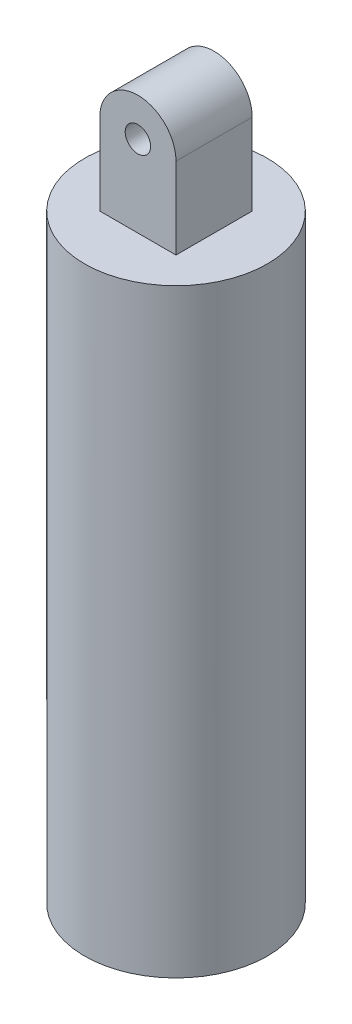
ISO-10303-21;
HEADER;
FILE_DESCRIPTION(('STEP AP214'),'2;1');
FILE_NAME('part.step','',(''),(''),'','','');
FILE_SCHEMA(('AUTOMOTIVE_DESIGN { 1 0 10303 214 1 1 1 1 }'));
ENDSEC;
DATA;
#1=APPLICATION_CONTEXT('core data for automotive mechanical design processes');
#2=APPLICATION_PROTOCOL_DEFINITION('international standard','automotive_design',2000,#1);
#3=PRODUCT_CONTEXT('',#1,'mechanical');
#4=PRODUCT('Part','Part','',(#3));
#5=PRODUCT_RELATED_PRODUCT_CATEGORY('part','',(#4));
#6=PRODUCT_DEFINITION_FORMATION('','',#4);
#7=PRODUCT_DEFINITION_CONTEXT('part definition',#1,'design');
#8=PRODUCT_DEFINITION('design','',#6,#7);
#9=PRODUCT_DEFINITION_SHAPE('','',#8);
#10=(LENGTH_UNIT() NAMED_UNIT(*) SI_UNIT(.MILLI.,.METRE.));
#11=(NAMED_UNIT(*) PLANE_ANGLE_UNIT() SI_UNIT($,.RADIAN.));
#12=(NAMED_UNIT(*) SI_UNIT($,.STERADIAN.) SOLID_ANGLE_UNIT());
#13=UNCERTAINTY_MEASURE_WITH_UNIT(LENGTH_MEASURE(1.E-05),#10,'distance_accuracy_value','');
#14=(GEOMETRIC_REPRESENTATION_CONTEXT(3) GLOBAL_UNCERTAINTY_ASSIGNED_CONTEXT((#13)) GLOBAL_UNIT_ASSIGNED_CONTEXT((#10,
#11,#12)) REPRESENTATION_CONTEXT('',''));
#15=CARTESIAN_POINT('',(0.,0.,0.));
#16=DIRECTION('',(0.,0.,1.));
#17=DIRECTION('',(1.,0.,0.));
#18=AXIS2_PLACEMENT_3D('',#15,#16,#17);
#19=CARTESIAN_POINT('',(0.,118.,0.));
#20=DIRECTION('',(0.,1.,0.));
#21=DIRECTION('',(0.,0.,1.));
#22=AXIS2_PLACEMENT_3D('',#19,#20,#21);
#23=PLANE('',#22);
#24=CARTESIAN_POINT('',(0.,118.,0.));
#25=DIRECTION('',(0.,1.,0.));
#26=DIRECTION('',(0.,0.,1.));
#27=AXIS2_PLACEMENT_3D('',#24,#25,#26);
#28=CIRCLE('',#27,18.);
#29=CARTESIAN_POINT('',(0.,118.,18.));
#30=VERTEX_POINT('',#29);
#31=EDGE_CURVE('E123',#30,#30,#28,.T.);
#32=ORIENTED_EDGE('',*,*,#31,.T.);
#33=EDGE_LOOP('',(#32));
#34=FACE_BOUND('',#33,.T.);
#35=DIRECTION('',(1.,0.,0.));
#36=VECTOR('',#35,1.);
#37=CARTESIAN_POINT('',(-7.5,118.,-7.5));
#38=LINE('',#37,#36);
#39=CARTESIAN_POINT('',(-7.5,118.,-7.5));
#40=VERTEX_POINT('',#39);
#41=CARTESIAN_POINT('',(7.5,118.,-7.5));
#42=VERTEX_POINT('',#41);
#43=EDGE_CURVE('E58',#40,#42,#38,.T.);
#44=ORIENTED_EDGE('',*,*,#43,.T.);
#45=DIRECTION('',(0.,0.,-1.));
#46=VECTOR('',#45,1.);
#47=CARTESIAN_POINT('',(7.5,118.,7.5));
#48=LINE('',#47,#46);
#49=CARTESIAN_POINT('',(7.5,118.,7.5));
#50=VERTEX_POINT('',#49);
#51=EDGE_CURVE('E104',#50,#42,#48,.T.);
#52=ORIENTED_EDGE('',*,*,#51,.F.);
#53=DIRECTION('',(1.,0.,0.));
#54=VECTOR('',#53,1.);
#55=CARTESIAN_POINT('',(-7.5,118.,7.5));
#56=LINE('',#55,#54);
#57=CARTESIAN_POINT('',(-7.5,118.,7.5));
#58=VERTEX_POINT('',#57);
#59=EDGE_CURVE('E98',#58,#50,#56,.T.);
#60=ORIENTED_EDGE('',*,*,#59,.F.);
#61=DIRECTION('',(0.,0.,-1.));
#62=VECTOR('',#61,1.);
#63=CARTESIAN_POINT('',(-7.5,118.,7.5));
#64=LINE('',#63,#62);
#65=EDGE_CURVE('E109',#58,#40,#64,.T.);
#66=ORIENTED_EDGE('',*,*,#65,.T.);
#67=EDGE_LOOP('',(#44,#52,#60,#66));
#68=FACE_BOUND('',#67,.T.);
#69=ADVANCED_FACE('F43',(#34,#68),#23,.T.);
#70=CARTESIAN_POINT('',(0.,0.,0.));
#71=DIRECTION('',(0.,1.,0.));
#72=DIRECTION('',(0.,0.,1.));
#73=AXIS2_PLACEMENT_3D('',#70,#71,#72);
#74=PLANE('',#73);
#75=CARTESIAN_POINT('',(0.,0.,0.));
#76=DIRECTION('',(0.,1.,0.));
#77=DIRECTION('',(1.,0.,0.));
#78=AXIS2_PLACEMENT_3D('',#75,#76,#77);
#79=CIRCLE('',#78,18.);
#80=CARTESIAN_POINT('',(18.,0.,0.));
#81=VERTEX_POINT('',#80);
#82=EDGE_CURVE('E12',#81,#81,#79,.T.);
#83=ORIENTED_EDGE('',*,*,#82,.F.);
#84=EDGE_LOOP('',(#83));
#85=FACE_BOUND('',#84,.T.);
#86=CARTESIAN_POINT('',(0.,0.,0.));
#87=DIRECTION('',(0.,1.,0.));
#88=DIRECTION('',(0.,0.,1.));
#89=AXIS2_PLACEMENT_3D('',#86,#87,#88);
#90=CIRCLE('',#89,15.);
#91=CARTESIAN_POINT('',(0.,0.,15.));
#92=VERTEX_POINT('',#91);
#93=EDGE_CURVE('E51',#92,#92,#90,.T.);
#94=ORIENTED_EDGE('',*,*,#93,.T.);
#95=EDGE_LOOP('',(#94));
#96=FACE_BOUND('',#95,.T.);
#97=ADVANCED_FACE('F131',(#85,#96),#74,.F.);
#98=CARTESIAN_POINT('',(0.,115.,0.));
#99=DIRECTION('',(0.,-1.,0.));
#100=DIRECTION('',(0.,0.,-1.));
#101=AXIS2_PLACEMENT_3D('',#98,#99,#100);
#102=CYLINDRICAL_SURFACE('',#101,18.);
#103=ORIENTED_EDGE('',*,*,#82,.T.);
#104=EDGE_LOOP('',(#103));
#105=FACE_BOUND('',#104,.T.);
#106=ORIENTED_EDGE('',*,*,#31,.F.);
#107=EDGE_LOOP('',(#106));
#108=FACE_BOUND('',#107,.T.);
#109=ADVANCED_FACE('F45',(#105,#108),#102,.T.);
#110=CARTESIAN_POINT('',(0.,115.,0.));
#111=DIRECTION('',(0.,-1.,0.));
#112=DIRECTION('',(0.,0.,-1.));
#113=AXIS2_PLACEMENT_3D('',#110,#111,#112);
#114=CYLINDRICAL_SURFACE('',#113,15.);
#115=CARTESIAN_POINT('',(0.,115.,0.));
#116=DIRECTION('',(0.,1.,0.));
#117=DIRECTION('',(0.,0.,1.));
#118=AXIS2_PLACEMENT_3D('',#115,#116,#117);
#119=CIRCLE('',#118,15.);
#120=CARTESIAN_POINT('',(0.,115.,15.));
#121=VERTEX_POINT('',#120);
#122=EDGE_CURVE('E126',#121,#121,#119,.T.);
#123=ORIENTED_EDGE('',*,*,#122,.T.);
#124=EDGE_LOOP('',(#123));
#125=FACE_BOUND('',#124,.T.);
#126=ORIENTED_EDGE('',*,*,#93,.F.);
#127=EDGE_LOOP('',(#126));
#128=FACE_BOUND('',#127,.T.);
#129=ADVANCED_FACE('F133',(#125,#128),#114,.F.);
#130=CARTESIAN_POINT('',(0.,115.,0.));
#131=DIRECTION('',(0.,1.,0.));
#132=DIRECTION('',(0.,0.,1.));
#133=AXIS2_PLACEMENT_3D('',#130,#131,#132);
#134=PLANE('',#133);
#135=ORIENTED_EDGE('',*,*,#122,.F.);
#136=EDGE_LOOP('',(#135));
#137=FACE_BOUND('',#136,.T.);
#138=ADVANCED_FACE('F135',(#137),#134,.F.);
#139=CARTESIAN_POINT('',(0.,134.,7.5));
#140=DIRECTION('',(0.,0.,-1.));
#141=DIRECTION('',(-1.,0.,0.));
#142=AXIS2_PLACEMENT_3D('',#139,#140,#141);
#143=PLANE('',#142);
#144=ORIENTED_EDGE('',*,*,#59,.T.);
#145=DIRECTION('',(0.,1.,0.));
#146=VECTOR('',#145,1.);
#147=CARTESIAN_POINT('',(7.5,134.,7.5));
#148=LINE('',#147,#146);
#149=CARTESIAN_POINT('',(7.5,134.,7.5));
#150=VERTEX_POINT('',#149);
#151=EDGE_CURVE('E92',#50,#150,#148,.T.);
#152=ORIENTED_EDGE('',*,*,#151,.T.);
#153=CARTESIAN_POINT('',(0.,134.,7.5));
#154=DIRECTION('',(0.,0.,1.));
#155=DIRECTION('',(-1.,0.,0.));
#156=AXIS2_PLACEMENT_3D('',#153,#154,#155);
#157=CIRCLE('',#156,7.5);
#158=CARTESIAN_POINT('',(-7.5,134.,7.5));
#159=VERTEX_POINT('',#158);
#160=EDGE_CURVE('E96',#150,#159,#157,.T.);
#161=ORIENTED_EDGE('',*,*,#160,.T.);
#162=DIRECTION('',(0.,-1.,0.));
#163=VECTOR('',#162,1.);
#164=CARTESIAN_POINT('',(-7.5,118.,7.5));
#165=LINE('',#164,#163);
#166=EDGE_CURVE('E67',#159,#58,#165,.T.);
#167=ORIENTED_EDGE('',*,*,#166,.T.);
#168=EDGE_LOOP('',(#144,#152,#161,#167));
#169=FACE_BOUND('',#168,.T.);
#170=CARTESIAN_POINT('',(0.,134.,7.5));
#171=DIRECTION('',(0.,0.,1.));
#172=DIRECTION('',(1.,0.,0.));
#173=AXIS2_PLACEMENT_3D('',#170,#171,#172);
#174=CIRCLE('',#173,2.5);
#175=CARTESIAN_POINT('',(2.5,134.,7.5));
#176=VERTEX_POINT('',#175);
#177=EDGE_CURVE('E114',#176,#176,#174,.T.);
#178=ORIENTED_EDGE('',*,*,#177,.F.);
#179=EDGE_LOOP('',(#178));
#180=FACE_BOUND('',#179,.T.);
#181=ADVANCED_FACE('F93',(#169,#180),#143,.F.);
#182=CARTESIAN_POINT('',(0.,134.,-7.5));
#183=DIRECTION('',(0.,0.,-1.));
#184=DIRECTION('',(-1.,0.,0.));
#185=AXIS2_PLACEMENT_3D('',#182,#183,#184);
#186=PLANE('',#185);
#187=ORIENTED_EDGE('',*,*,#43,.F.);
#188=DIRECTION('',(0.,-1.,0.));
#189=VECTOR('',#188,1.);
#190=CARTESIAN_POINT('',(-7.5,118.,-7.5));
#191=LINE('',#190,#189);
#192=CARTESIAN_POINT('',(-7.5,134.,-7.5));
#193=VERTEX_POINT('',#192);
#194=EDGE_CURVE('E117',#193,#40,#191,.T.);
#195=ORIENTED_EDGE('',*,*,#194,.F.);
#196=CARTESIAN_POINT('',(0.,134.,-7.5));
#197=DIRECTION('',(0.,0.,1.));
#198=DIRECTION('',(-1.,0.,0.));
#199=AXIS2_PLACEMENT_3D('',#196,#197,#198);
#200=CIRCLE('',#199,7.5);
#201=CARTESIAN_POINT('',(7.5,134.,-7.5));
#202=VERTEX_POINT('',#201);
#203=EDGE_CURVE('E84',#202,#193,#200,.T.);
#204=ORIENTED_EDGE('',*,*,#203,.F.);
#205=DIRECTION('',(0.,1.,0.));
#206=VECTOR('',#205,1.);
#207=CARTESIAN_POINT('',(7.5,134.,-7.5));
#208=LINE('',#207,#206);
#209=EDGE_CURVE('E103',#42,#202,#208,.T.);
#210=ORIENTED_EDGE('',*,*,#209,.F.);
#211=EDGE_LOOP('',(#187,#195,#204,#210));
#212=FACE_BOUND('',#211,.T.);
#213=CARTESIAN_POINT('',(0.,134.,-7.5));
#214=DIRECTION('',(0.,0.,1.));
#215=DIRECTION('',(1.,0.,0.));
#216=AXIS2_PLACEMENT_3D('',#213,#214,#215);
#217=CIRCLE('',#216,2.5);
#218=CARTESIAN_POINT('',(2.5,134.,-7.5));
#219=VERTEX_POINT('',#218);
#220=EDGE_CURVE('E177',#219,#219,#217,.T.);
#221=ORIENTED_EDGE('',*,*,#220,.T.);
#222=EDGE_LOOP('',(#221));
#223=FACE_BOUND('',#222,.T.);
#224=ADVANCED_FACE('F157',(#212,#223),#186,.T.);
#225=CARTESIAN_POINT('',(7.5,134.,7.5));
#226=DIRECTION('',(-1.,0.,0.));
#227=DIRECTION('',(0.,-1.,0.));
#228=AXIS2_PLACEMENT_3D('',#225,#226,#227);
#229=PLANE('',#228);
#230=ORIENTED_EDGE('',*,*,#209,.T.);
#231=DIRECTION('',(0.,0.,-1.));
#232=VECTOR('',#231,1.);
#233=CARTESIAN_POINT('',(7.5,134.,7.5));
#234=LINE('',#233,#232);
#235=EDGE_CURVE('E101',#150,#202,#234,.T.);
#236=ORIENTED_EDGE('',*,*,#235,.F.);
#237=ORIENTED_EDGE('',*,*,#151,.F.);
#238=ORIENTED_EDGE('',*,*,#51,.T.);
#239=EDGE_LOOP('',(#230,#236,#237,#238));
#240=FACE_BOUND('',#239,.T.);
#241=ADVANCED_FACE('F102',(#240),#229,.F.);
#242=CARTESIAN_POINT('',(0.,134.,7.5));
#243=DIRECTION('',(0.,0.,-1.));
#244=DIRECTION('',(-1.,0.,0.));
#245=AXIS2_PLACEMENT_3D('',#242,#243,#244);
#246=CYLINDRICAL_SURFACE('',#245,7.5);
#247=ORIENTED_EDGE('',*,*,#203,.T.);
#248=DIRECTION('',(0.,0.,-1.));
#249=VECTOR('',#248,1.);
#250=CARTESIAN_POINT('',(-7.5,134.,7.5));
#251=LINE('',#250,#249);
#252=EDGE_CURVE('E105',#159,#193,#251,.T.);
#253=ORIENTED_EDGE('',*,*,#252,.F.);
#254=ORIENTED_EDGE('',*,*,#160,.F.);
#255=ORIENTED_EDGE('',*,*,#235,.T.);
#256=EDGE_LOOP('',(#247,#253,#254,#255));
#257=FACE_BOUND('',#256,.T.);
#258=ADVANCED_FACE('F107',(#257),#246,.T.);
#259=CARTESIAN_POINT('',(-7.5,118.,7.5));
#260=DIRECTION('',(1.,0.,0.));
#261=DIRECTION('',(0.,1.,0.));
#262=AXIS2_PLACEMENT_3D('',#259,#260,#261);
#263=PLANE('',#262);
#264=ORIENTED_EDGE('',*,*,#194,.T.);
#265=ORIENTED_EDGE('',*,*,#65,.F.);
#266=ORIENTED_EDGE('',*,*,#166,.F.);
#267=ORIENTED_EDGE('',*,*,#252,.T.);
#268=EDGE_LOOP('',(#264,#265,#266,#267));
#269=FACE_BOUND('',#268,.T.);
#270=ADVANCED_FACE('F160',(#269),#263,.F.);
#271=CARTESIAN_POINT('',(0.,134.,7.5));
#272=DIRECTION('',(0.,0.,-1.));
#273=DIRECTION('',(-1.,0.,0.));
#274=AXIS2_PLACEMENT_3D('',#271,#272,#273);
#275=CYLINDRICAL_SURFACE('',#274,2.5);
#276=ORIENTED_EDGE('',*,*,#177,.T.);
#277=EDGE_LOOP('',(#276));
#278=FACE_BOUND('',#277,.T.);
#279=ORIENTED_EDGE('',*,*,#220,.F.);
#280=EDGE_LOOP('',(#279));
#281=FACE_BOUND('',#280,.T.);
#282=ADVANCED_FACE('F163',(#278,#281),#275,.F.);
#283=CLOSED_SHELL('',(#69,#97,#109,#129,#138,#181,#224,#241,#258,#270,#282));
#284=MANIFOLD_SOLID_BREP('B2',#283);
#285=ADVANCED_BREP_SHAPE_REPRESENTATION('',(#18,#284),#14);
#286=SHAPE_DEFINITION_REPRESENTATION(#9,#285);
ENDSEC;
END-ISO-10303-21;
